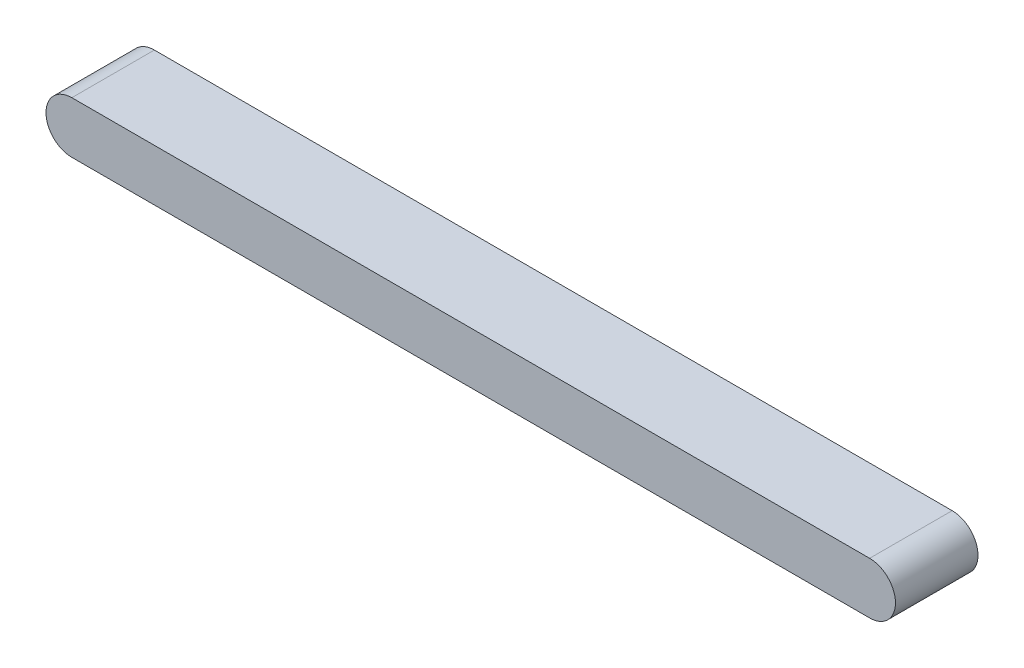
ISO-10303-21;
HEADER;
FILE_DESCRIPTION(('STEP AP214'),'2;1');
FILE_NAME('part.step','',(''),(''),'','','');
FILE_SCHEMA(('AUTOMOTIVE_DESIGN { 1 0 10303 214 1 1 1 1 }'));
ENDSEC;
DATA;
#1=APPLICATION_CONTEXT('core data for automotive mechanical design processes');
#2=APPLICATION_PROTOCOL_DEFINITION('international standard','automotive_design',2000,#1);
#3=PRODUCT_CONTEXT('',#1,'mechanical');
#4=PRODUCT('Part','Part','',(#3));
#5=PRODUCT_RELATED_PRODUCT_CATEGORY('part','',(#4));
#6=PRODUCT_DEFINITION_FORMATION('','',#4);
#7=PRODUCT_DEFINITION_CONTEXT('part definition',#1,'design');
#8=PRODUCT_DEFINITION('design','',#6,#7);
#9=PRODUCT_DEFINITION_SHAPE('','',#8);
#10=(LENGTH_UNIT() NAMED_UNIT(*) SI_UNIT(.MILLI.,.METRE.));
#11=(NAMED_UNIT(*) PLANE_ANGLE_UNIT() SI_UNIT($,.RADIAN.));
#12=(NAMED_UNIT(*) SI_UNIT($,.STERADIAN.) SOLID_ANGLE_UNIT());
#13=UNCERTAINTY_MEASURE_WITH_UNIT(LENGTH_MEASURE(1.E-05),#10,'distance_accuracy_value','');
#14=(GEOMETRIC_REPRESENTATION_CONTEXT(3) GLOBAL_UNCERTAINTY_ASSIGNED_CONTEXT((#13)) GLOBAL_UNIT_ASSIGNED_CONTEXT((#10,
#11,#12)) REPRESENTATION_CONTEXT('',''));
#15=CARTESIAN_POINT('',(0.,0.,0.));
#16=DIRECTION('',(0.,0.,1.));
#17=DIRECTION('',(1.,0.,0.));
#18=AXIS2_PLACEMENT_3D('',#15,#16,#17);
#19=CARTESIAN_POINT('',(0.,0.,7.5));
#20=DIRECTION('',(0.,0.,-1.));
#21=DIRECTION('',(-1.,0.,0.));
#22=AXIS2_PLACEMENT_3D('',#19,#20,#21);
#23=CYLINDRICAL_SURFACE('',#22,4.69548436363979);
#24=CARTESIAN_POINT('',(0.,0.,-7.5));
#25=DIRECTION('',(0.,0.,1.));
#26=DIRECTION('',(1.,0.,0.));
#27=AXIS2_PLACEMENT_3D('',#24,#25,#26);
#28=CIRCLE('',#27,4.69548436363979);
#29=CARTESIAN_POINT('',(0.,4.69548436363979,-7.5));
#30=VERTEX_POINT('',#29);
#31=CARTESIAN_POINT('',(0.,-4.69548436363979,-7.5));
#32=VERTEX_POINT('',#31);
#33=EDGE_CURVE('E107',#30,#32,#28,.T.);
#34=ORIENTED_EDGE('',*,*,#33,.T.);
#35=DIRECTION('',(0.,0.,-1.));
#36=VECTOR('',#35,1.);
#37=CARTESIAN_POINT('',(0.,-4.69548436363979,7.5));
#38=LINE('',#37,#36);
#39=CARTESIAN_POINT('',(0.,-4.69548436363979,7.5));
#40=VERTEX_POINT('',#39);
#41=EDGE_CURVE('E11',#40,#32,#38,.T.);
#42=ORIENTED_EDGE('',*,*,#41,.F.);
#43=CARTESIAN_POINT('',(0.,0.,7.5));
#44=DIRECTION('',(0.,0.,1.));
#45=DIRECTION('',(1.,0.,0.));
#46=AXIS2_PLACEMENT_3D('',#43,#44,#45);
#47=CIRCLE('',#46,4.69548436363979);
#48=CARTESIAN_POINT('',(0.,4.69548436363979,7.5));
#49=VERTEX_POINT('',#48);
#50=EDGE_CURVE('E91',#49,#40,#47,.T.);
#51=ORIENTED_EDGE('',*,*,#50,.F.);
#52=DIRECTION('',(0.,0.,-1.));
#53=VECTOR('',#52,1.);
#54=CARTESIAN_POINT('',(0.,4.69548436363979,7.5));
#55=LINE('',#54,#53);
#56=EDGE_CURVE('E103',#49,#30,#55,.T.);
#57=ORIENTED_EDGE('',*,*,#56,.T.);
#58=EDGE_LOOP('',(#34,#42,#51,#57));
#59=FACE_BOUND('',#58,.T.);
#60=ADVANCED_FACE('F39',(#59),#23,.T.);
#61=CARTESIAN_POINT('',(0.,-4.69548436363979,7.5));
#62=DIRECTION('',(0.,1.,0.));
#63=DIRECTION('',(-1.,0.,0.));
#64=AXIS2_PLACEMENT_3D('',#61,#62,#63);
#65=PLANE('',#64);
#66=DIRECTION('',(1.,0.,0.));
#67=VECTOR('',#66,1.);
#68=CARTESIAN_POINT('',(0.,-4.69548436363979,-7.5));
#69=LINE('',#68,#67);
#70=CARTESIAN_POINT('',(145.,-4.69548436363979,-7.5));
#71=VERTEX_POINT('',#70);
#72=EDGE_CURVE('E96',#32,#71,#69,.T.);
#73=ORIENTED_EDGE('',*,*,#72,.T.);
#74=DIRECTION('',(0.,0.,-1.));
#75=VECTOR('',#74,1.);
#76=CARTESIAN_POINT('',(145.,-4.69548436363979,7.5));
#77=LINE('',#76,#75);
#78=CARTESIAN_POINT('',(145.,-4.69548436363979,7.5));
#79=VERTEX_POINT('',#78);
#80=EDGE_CURVE('E48',#79,#71,#77,.T.);
#81=ORIENTED_EDGE('',*,*,#80,.F.);
#82=DIRECTION('',(1.,0.,0.));
#83=VECTOR('',#82,1.);
#84=CARTESIAN_POINT('',(0.,-4.69548436363979,7.5));
#85=LINE('',#84,#83);
#86=EDGE_CURVE('E86',#40,#79,#85,.T.);
#87=ORIENTED_EDGE('',*,*,#86,.F.);
#88=ORIENTED_EDGE('',*,*,#41,.T.);
#89=EDGE_LOOP('',(#73,#81,#87,#88));
#90=FACE_BOUND('',#89,.T.);
#91=ADVANCED_FACE('F95',(#90),#65,.F.);
#92=CARTESIAN_POINT('',(145.,0.,7.5));
#93=DIRECTION('',(0.,0.,-1.));
#94=DIRECTION('',(-1.,0.,0.));
#95=AXIS2_PLACEMENT_3D('',#92,#93,#94);
#96=CYLINDRICAL_SURFACE('',#95,4.69548436363979);
#97=CARTESIAN_POINT('',(145.,0.,-7.5));
#98=DIRECTION('',(0.,0.,1.));
#99=DIRECTION('',(1.,0.,0.));
#100=AXIS2_PLACEMENT_3D('',#97,#98,#99);
#101=CIRCLE('',#100,4.69548436363979);
#102=CARTESIAN_POINT('',(145.,4.69548436363979,-7.5));
#103=VERTEX_POINT('',#102);
#104=EDGE_CURVE('E73',#71,#103,#101,.T.);
#105=ORIENTED_EDGE('',*,*,#104,.T.);
#106=DIRECTION('',(0.,0.,-1.));
#107=VECTOR('',#106,1.);
#108=CARTESIAN_POINT('',(145.,4.69548436363979,7.5));
#109=LINE('',#108,#107);
#110=CARTESIAN_POINT('',(145.,4.69548436363979,7.5));
#111=VERTEX_POINT('',#110);
#112=EDGE_CURVE('E98',#111,#103,#109,.T.);
#113=ORIENTED_EDGE('',*,*,#112,.F.);
#114=CARTESIAN_POINT('',(145.,0.,7.5));
#115=DIRECTION('',(0.,0.,1.));
#116=DIRECTION('',(1.,0.,0.));
#117=AXIS2_PLACEMENT_3D('',#114,#115,#116);
#118=CIRCLE('',#117,4.69548436363979);
#119=EDGE_CURVE('E89',#79,#111,#118,.T.);
#120=ORIENTED_EDGE('',*,*,#119,.F.);
#121=ORIENTED_EDGE('',*,*,#80,.T.);
#122=EDGE_LOOP('',(#105,#113,#120,#121));
#123=FACE_BOUND('',#122,.T.);
#124=ADVANCED_FACE('F99',(#123),#96,.T.);
#125=CARTESIAN_POINT('',(0.,4.69548436363979,7.5));
#126=DIRECTION('',(0.,-1.,0.));
#127=DIRECTION('',(1.,0.,0.));
#128=AXIS2_PLACEMENT_3D('',#125,#126,#127);
#129=PLANE('',#128);
#130=DIRECTION('',(-1.,0.,0.));
#131=VECTOR('',#130,1.);
#132=CARTESIAN_POINT('',(0.,4.69548436363979,-7.5));
#133=LINE('',#132,#131);
#134=EDGE_CURVE('E79',#103,#30,#133,.T.);
#135=ORIENTED_EDGE('',*,*,#134,.T.);
#136=ORIENTED_EDGE('',*,*,#56,.F.);
#137=DIRECTION('',(-1.,0.,0.));
#138=VECTOR('',#137,1.);
#139=CARTESIAN_POINT('',(0.,4.69548436363979,7.5));
#140=LINE('',#139,#138);
#141=EDGE_CURVE('E56',#111,#49,#140,.T.);
#142=ORIENTED_EDGE('',*,*,#141,.F.);
#143=ORIENTED_EDGE('',*,*,#112,.T.);
#144=EDGE_LOOP('',(#135,#136,#142,#143));
#145=FACE_BOUND('',#144,.T.);
#146=ADVANCED_FACE('F120',(#145),#129,.F.);
#147=CARTESIAN_POINT('',(0.,0.,7.5));
#148=DIRECTION('',(0.,0.,1.));
#149=DIRECTION('',(1.,0.,0.));
#150=AXIS2_PLACEMENT_3D('',#147,#148,#149);
#151=PLANE('',#150);
#152=ORIENTED_EDGE('',*,*,#50,.T.);
#153=ORIENTED_EDGE('',*,*,#86,.T.);
#154=ORIENTED_EDGE('',*,*,#119,.T.);
#155=ORIENTED_EDGE('',*,*,#141,.T.);
#156=EDGE_LOOP('',(#152,#153,#154,#155));
#157=FACE_BOUND('',#156,.T.);
#158=ADVANCED_FACE('F87',(#157),#151,.T.);
#159=CARTESIAN_POINT('',(0.,0.,-7.5));
#160=DIRECTION('',(0.,0.,1.));
#161=DIRECTION('',(1.,0.,0.));
#162=AXIS2_PLACEMENT_3D('',#159,#160,#161);
#163=PLANE('',#162);
#164=ORIENTED_EDGE('',*,*,#33,.F.);
#165=ORIENTED_EDGE('',*,*,#134,.F.);
#166=ORIENTED_EDGE('',*,*,#104,.F.);
#167=ORIENTED_EDGE('',*,*,#72,.F.);
#168=EDGE_LOOP('',(#164,#165,#166,#167));
#169=FACE_BOUND('',#168,.T.);
#170=ADVANCED_FACE('F123',(#169),#163,.F.);
#171=CLOSED_SHELL('',(#60,#91,#124,#146,#158,#170));
#172=MANIFOLD_SOLID_BREP('B2',#171);
#173=ADVANCED_BREP_SHAPE_REPRESENTATION('',(#18,#172),#14);
#174=SHAPE_DEFINITION_REPRESENTATION(#9,#173);
ENDSEC;
END-ISO-10303-21;
